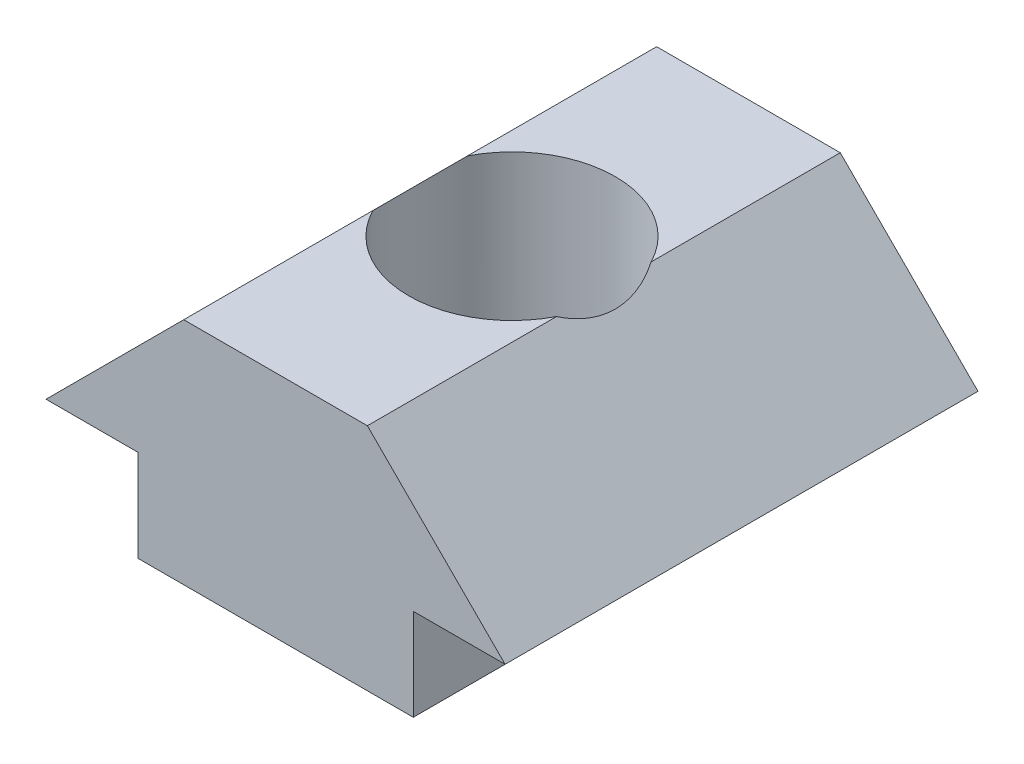
ISO-10303-21;
HEADER;
FILE_DESCRIPTION(('STEP AP214'),'2;1');
FILE_NAME('part.step','',(''),(''),'','','');
FILE_SCHEMA(('AUTOMOTIVE_DESIGN { 1 0 10303 214 1 1 1 1 }'));
ENDSEC;
DATA;
#1=APPLICATION_CONTEXT('core data for automotive mechanical design processes');
#2=APPLICATION_PROTOCOL_DEFINITION('international standard','automotive_design',2000,#1);
#3=PRODUCT_CONTEXT('',#1,'mechanical');
#4=PRODUCT('Part','Part','',(#3));
#5=PRODUCT_RELATED_PRODUCT_CATEGORY('part','',(#4));
#6=PRODUCT_DEFINITION_FORMATION('','',#4);
#7=PRODUCT_DEFINITION_CONTEXT('part definition',#1,'design');
#8=PRODUCT_DEFINITION('design','',#6,#7);
#9=PRODUCT_DEFINITION_SHAPE('','',#8);
#10=(LENGTH_UNIT() NAMED_UNIT(*) SI_UNIT(.MILLI.,.METRE.));
#11=(NAMED_UNIT(*) PLANE_ANGLE_UNIT() SI_UNIT($,.RADIAN.));
#12=(NAMED_UNIT(*) SI_UNIT($,.STERADIAN.) SOLID_ANGLE_UNIT());
#13=UNCERTAINTY_MEASURE_WITH_UNIT(LENGTH_MEASURE(1.E-05),#10,'distance_accuracy_value','');
#14=(GEOMETRIC_REPRESENTATION_CONTEXT(3) GLOBAL_UNCERTAINTY_ASSIGNED_CONTEXT((#13)) GLOBAL_UNIT_ASSIGNED_CONTEXT((#10,
#11,#12)) REPRESENTATION_CONTEXT('',''));
#15=CARTESIAN_POINT('',(0.,0.,0.));
#16=DIRECTION('',(0.,0.,1.));
#17=DIRECTION('',(1.,0.,0.));
#18=AXIS2_PLACEMENT_3D('',#15,#16,#17);
#19=CARTESIAN_POINT('',(-1.,5.,10.3));
#20=DIRECTION('',(0.,-1.,0.));
#21=DIRECTION('',(0.,0.,-1.));
#22=AXIS2_PLACEMENT_3D('',#19,#20,#21);
#23=PLANE('',#22);
#24=CARTESIAN_POINT('',(-3.,5.,5.15));
#25=DIRECTION('',(0.,1.,0.));
#26=DIRECTION('',(0.,0.,1.));
#27=AXIS2_PLACEMENT_3D('',#24,#25,#26);
#28=CIRCLE('',#27,2.24999999999999);
#29=CARTESIAN_POINT('',(-1.,5.,4.11922359359561));
#30=VERTEX_POINT('',#29);
#31=CARTESIAN_POINT('',(-5.,5.,4.11922359359561));
#32=VERTEX_POINT('',#31);
#33=EDGE_CURVE('E45',#30,#32,#28,.T.);
#34=ORIENTED_EDGE('',*,*,#33,.F.);
#35=DIRECTION('',(0.,0.,-1.));
#36=VECTOR('',#35,1.);
#37=CARTESIAN_POINT('',(-1.,5.,10.3));
#38=LINE('',#37,#36);
#39=CARTESIAN_POINT('',(-1.,5.,0.));
#40=VERTEX_POINT('',#39);
#41=EDGE_CURVE('E167',#30,#40,#38,.T.);
#42=ORIENTED_EDGE('',*,*,#41,.T.);
#43=DIRECTION('',(-1.,0.,0.));
#44=VECTOR('',#43,1.);
#45=CARTESIAN_POINT('',(-1.,5.,0.));
#46=LINE('',#45,#44);
#47=CARTESIAN_POINT('',(-5.,5.,0.));
#48=VERTEX_POINT('',#47);
#49=EDGE_CURVE('E155',#40,#48,#46,.T.);
#50=ORIENTED_EDGE('',*,*,#49,.T.);
#51=DIRECTION('',(0.,0.,-1.));
#52=VECTOR('',#51,1.);
#53=CARTESIAN_POINT('',(-5.,5.,10.3));
#54=LINE('',#53,#52);
#55=EDGE_CURVE('E135',#32,#48,#54,.T.);
#56=ORIENTED_EDGE('',*,*,#55,.F.);
#57=EDGE_LOOP('',(#34,#42,#50,#56));
#58=FACE_BOUND('',#57,.T.);
#59=ADVANCED_FACE('F37',(#58),#23,.F.);
#60=CARTESIAN_POINT('',(-5.,5.,6.18077640640439));
#61=VERTEX_POINT('',#60);
#62=CARTESIAN_POINT('',(-1.,5.,6.18077640640439));
#63=VERTEX_POINT('',#62);
#64=EDGE_CURVE('E177',#61,#63,#28,.T.);
#65=ORIENTED_EDGE('',*,*,#64,.F.);
#66=CARTESIAN_POINT('',(-5.,5.,10.3));
#67=VERTEX_POINT('',#66);
#68=EDGE_CURVE('E165',#67,#61,#54,.T.);
#69=ORIENTED_EDGE('',*,*,#68,.F.);
#70=DIRECTION('',(-1.,0.,0.));
#71=VECTOR('',#70,1.);
#72=CARTESIAN_POINT('',(-1.,5.,10.3));
#73=LINE('',#72,#71);
#74=CARTESIAN_POINT('',(-1.,5.,10.3));
#75=VERTEX_POINT('',#74);
#76=EDGE_CURVE('E123',#75,#67,#73,.T.);
#77=ORIENTED_EDGE('',*,*,#76,.F.);
#78=EDGE_CURVE('E168',#75,#63,#38,.T.);
#79=ORIENTED_EDGE('',*,*,#78,.T.);
#80=EDGE_LOOP('',(#65,#69,#77,#79));
#81=FACE_BOUND('',#80,.T.);
#82=ADVANCED_FACE('F201',(#81),#23,.F.);
#83=CARTESIAN_POINT('',(-6.,0.,10.3));
#84=DIRECTION('',(0.,1.,0.));
#85=DIRECTION('',(0.,0.,1.));
#86=AXIS2_PLACEMENT_3D('',#83,#84,#85);
#87=PLANE('',#86);
#88=CARTESIAN_POINT('',(-3.,0.,5.15));
#89=DIRECTION('',(0.,1.,0.));
#90=DIRECTION('',(0.,0.,1.));
#91=AXIS2_PLACEMENT_3D('',#88,#89,#90);
#92=CIRCLE('',#91,2.25);
#93=CARTESIAN_POINT('',(-3.,0.,7.4));
#94=VERTEX_POINT('',#93);
#95=EDGE_CURVE('E184',#94,#94,#92,.T.);
#96=ORIENTED_EDGE('',*,*,#95,.T.);
#97=EDGE_LOOP('',(#96));
#98=FACE_BOUND('',#97,.T.);
#99=DIRECTION('',(1.,0.,0.));
#100=VECTOR('',#99,1.);
#101=CARTESIAN_POINT('',(-6.,0.,0.));
#102=LINE('',#101,#100);
#103=CARTESIAN_POINT('',(-6.,0.,0.));
#104=VERTEX_POINT('',#103);
#105=CARTESIAN_POINT('',(0.,0.,0.));
#106=VERTEX_POINT('',#105);
#107=EDGE_CURVE('E144',#104,#106,#102,.T.);
#108=ORIENTED_EDGE('',*,*,#107,.T.);
#109=DIRECTION('',(0.,0.,-1.));
#110=VECTOR('',#109,1.);
#111=CARTESIAN_POINT('',(0.,0.,10.3));
#112=LINE('',#111,#110);
#113=CARTESIAN_POINT('',(0.,0.,10.3));
#114=VERTEX_POINT('',#113);
#115=EDGE_CURVE('E176',#114,#106,#112,.T.);
#116=ORIENTED_EDGE('',*,*,#115,.F.);
#117=DIRECTION('',(1.,0.,0.));
#118=VECTOR('',#117,1.);
#119=CARTESIAN_POINT('',(-6.,0.,10.3));
#120=LINE('',#119,#118);
#121=CARTESIAN_POINT('',(-6.,0.,10.3));
#122=VERTEX_POINT('',#121);
#123=EDGE_CURVE('E162',#122,#114,#120,.T.);
#124=ORIENTED_EDGE('',*,*,#123,.F.);
#125=DIRECTION('',(0.,0.,-1.));
#126=VECTOR('',#125,1.);
#127=CARTESIAN_POINT('',(-6.,0.,10.3));
#128=LINE('',#127,#126);
#129=EDGE_CURVE('E140',#122,#104,#128,.T.);
#130=ORIENTED_EDGE('',*,*,#129,.T.);
#131=EDGE_LOOP('',(#108,#116,#124,#130));
#132=FACE_BOUND('',#131,.T.);
#133=ADVANCED_FACE('F39',(#98,#132),#87,.F.);
#134=CARTESIAN_POINT('',(0.,0.,10.3));
#135=DIRECTION('',(-1.,0.,0.));
#136=DIRECTION('',(0.,0.,1.));
#137=AXIS2_PLACEMENT_3D('',#134,#135,#136);
#138=PLANE('',#137);
#139=DIRECTION('',(0.,1.,0.));
#140=VECTOR('',#139,1.);
#141=CARTESIAN_POINT('',(0.,0.,0.));
#142=LINE('',#141,#140);
#143=CARTESIAN_POINT('',(0.,2.00000000000003,0.));
#144=VERTEX_POINT('',#143);
#145=EDGE_CURVE('E147',#106,#144,#142,.T.);
#146=ORIENTED_EDGE('',*,*,#145,.T.);
#147=DIRECTION('',(0.,0.,-1.));
#148=VECTOR('',#147,1.);
#149=CARTESIAN_POINT('',(0.,2.00000000000003,10.3));
#150=LINE('',#149,#148);
#151=CARTESIAN_POINT('',(0.,2.00000000000003,10.3));
#152=VERTEX_POINT('',#151);
#153=EDGE_CURVE('E174',#152,#144,#150,.T.);
#154=ORIENTED_EDGE('',*,*,#153,.F.);
#155=DIRECTION('',(0.,1.,0.));
#156=VECTOR('',#155,1.);
#157=CARTESIAN_POINT('',(0.,0.,10.3));
#158=LINE('',#157,#156);
#159=EDGE_CURVE('E101',#114,#152,#158,.T.);
#160=ORIENTED_EDGE('',*,*,#159,.F.);
#161=ORIENTED_EDGE('',*,*,#115,.T.);
#162=EDGE_LOOP('',(#146,#154,#160,#161));
#163=FACE_BOUND('',#162,.T.);
#164=ADVANCED_FACE('F214',(#163),#138,.F.);
#165=CARTESIAN_POINT('',(0.,2.00000000000003,10.3));
#166=DIRECTION('',(0.,1.,0.));
#167=DIRECTION('',(0.,0.,1.));
#168=AXIS2_PLACEMENT_3D('',#165,#166,#167);
#169=PLANE('',#168);
#170=DIRECTION('',(1.,0.,0.));
#171=VECTOR('',#170,1.);
#172=CARTESIAN_POINT('',(0.,2.00000000000003,0.));
#173=LINE('',#172,#171);
#174=CARTESIAN_POINT('',(2.,2.00000000000003,0.));
#175=VERTEX_POINT('',#174);
#176=EDGE_CURVE('E150',#144,#175,#173,.T.);
#177=ORIENTED_EDGE('',*,*,#176,.T.);
#178=DIRECTION('',(0.,0.,-1.));
#179=VECTOR('',#178,1.);
#180=CARTESIAN_POINT('',(2.,2.00000000000003,10.3));
#181=LINE('',#180,#179);
#182=CARTESIAN_POINT('',(2.,2.00000000000003,10.3));
#183=VERTEX_POINT('',#182);
#184=EDGE_CURVE('E171',#183,#175,#181,.T.);
#185=ORIENTED_EDGE('',*,*,#184,.F.);
#186=DIRECTION('',(1.,0.,0.));
#187=VECTOR('',#186,1.);
#188=CARTESIAN_POINT('',(0.,2.00000000000003,10.3));
#189=LINE('',#188,#187);
#190=EDGE_CURVE('E190',#152,#183,#189,.T.);
#191=ORIENTED_EDGE('',*,*,#190,.F.);
#192=ORIENTED_EDGE('',*,*,#153,.T.);
#193=EDGE_LOOP('',(#177,#185,#191,#192));
#194=FACE_BOUND('',#193,.T.);
#195=ADVANCED_FACE('F217',(#194),#169,.F.);
#196=CARTESIAN_POINT('',(2.,2.00000000000003,10.3));
#197=DIRECTION('',(-0.707106781186544,-0.707106781186551,0.));
#198=DIRECTION('',(0.707106781186551,-0.707106781186544,0.));
#199=AXIS2_PLACEMENT_3D('',#196,#197,#198);
#200=PLANE('',#199);
#201=ORIENTED_EDGE('',*,*,#41,.F.);
#202=CARTESIAN_POINT('',(-3.,6.99999999999998,5.15));
#203=DIRECTION('',(-0.707106781186544,-0.707106781186551,0.));
#204=DIRECTION('',(-0.707106781186551,0.707106781186544,0.));
#205=AXIS2_PLACEMENT_3D('',#202,#203,#204);
#206=ELLIPSE('',#205,3.18198051533944,2.24999999999999);
#207=EDGE_CURVE('E148',#30,#63,#206,.T.);
#208=ORIENTED_EDGE('',*,*,#207,.T.);
#209=ORIENTED_EDGE('',*,*,#78,.F.);
#210=DIRECTION('',(-0.707106781186551,0.707106781186544,0.));
#211=VECTOR('',#210,1.);
#212=CARTESIAN_POINT('',(2.,2.00000000000003,10.3));
#213=LINE('',#212,#211);
#214=EDGE_CURVE('E192',#183,#75,#213,.T.);
#215=ORIENTED_EDGE('',*,*,#214,.F.);
#216=ORIENTED_EDGE('',*,*,#184,.T.);
#217=DIRECTION('',(-0.707106781186551,0.707106781186544,0.));
#218=VECTOR('',#217,1.);
#219=CARTESIAN_POINT('',(2.,2.00000000000003,0.));
#220=LINE('',#219,#218);
#221=EDGE_CURVE('E152',#175,#40,#220,.T.);
#222=ORIENTED_EDGE('',*,*,#221,.T.);
#223=EDGE_LOOP('',(#201,#208,#209,#215,#216,#222));
#224=FACE_BOUND('',#223,.T.);
#225=ADVANCED_FACE('F199',(#224),#200,.F.);
#226=CARTESIAN_POINT('',(-5.,5.,10.3));
#227=DIRECTION('',(0.707106781186544,-0.707106781186551,0.));
#228=DIRECTION('',(0.707106781186551,0.707106781186544,0.));
#229=AXIS2_PLACEMENT_3D('',#226,#227,#228);
#230=PLANE('',#229);
#231=ORIENTED_EDGE('',*,*,#68,.T.);
#232=CARTESIAN_POINT('',(-3.,6.99999999999998,5.15));
#233=DIRECTION('',(0.707106781186544,-0.707106781186551,0.));
#234=DIRECTION('',(0.707106781186551,0.707106781186544,0.));
#235=AXIS2_PLACEMENT_3D('',#232,#233,#234);
#236=ELLIPSE('',#235,3.18198051533944,2.24999999999999);
#237=EDGE_CURVE('E11',#61,#32,#236,.T.);
#238=ORIENTED_EDGE('',*,*,#237,.T.);
#239=ORIENTED_EDGE('',*,*,#55,.T.);
#240=DIRECTION('',(-0.707106781186551,-0.707106781186544,0.));
#241=VECTOR('',#240,1.);
#242=CARTESIAN_POINT('',(-5.,5.,0.));
#243=LINE('',#242,#241);
#244=CARTESIAN_POINT('',(-8.,2.00000000000003,0.));
#245=VERTEX_POINT('',#244);
#246=EDGE_CURVE('E132',#48,#245,#243,.T.);
#247=ORIENTED_EDGE('',*,*,#246,.T.);
#248=DIRECTION('',(0.,0.,-1.));
#249=VECTOR('',#248,1.);
#250=CARTESIAN_POINT('',(-8.,2.00000000000003,10.3));
#251=LINE('',#250,#249);
#252=CARTESIAN_POINT('',(-8.,2.00000000000003,10.3));
#253=VERTEX_POINT('',#252);
#254=EDGE_CURVE('E129',#253,#245,#251,.T.);
#255=ORIENTED_EDGE('',*,*,#254,.F.);
#256=DIRECTION('',(-0.707106781186551,-0.707106781186544,0.));
#257=VECTOR('',#256,1.);
#258=CARTESIAN_POINT('',(-5.,5.,10.3));
#259=LINE('',#258,#257);
#260=EDGE_CURVE('E116',#67,#253,#259,.T.);
#261=ORIENTED_EDGE('',*,*,#260,.F.);
#262=EDGE_LOOP('',(#231,#238,#239,#247,#255,#261));
#263=FACE_BOUND('',#262,.T.);
#264=ADVANCED_FACE('F130',(#263),#230,.F.);
#265=CARTESIAN_POINT('',(-8.,2.00000000000003,10.3));
#266=DIRECTION('',(0.,1.,0.));
#267=DIRECTION('',(0.,0.,1.));
#268=AXIS2_PLACEMENT_3D('',#265,#266,#267);
#269=PLANE('',#268);
#270=DIRECTION('',(1.,0.,0.));
#271=VECTOR('',#270,1.);
#272=CARTESIAN_POINT('',(-8.,2.00000000000003,0.));
#273=LINE('',#272,#271);
#274=CARTESIAN_POINT('',(-6.,2.00000000000003,0.));
#275=VERTEX_POINT('',#274);
#276=EDGE_CURVE('E159',#245,#275,#273,.T.);
#277=ORIENTED_EDGE('',*,*,#276,.T.);
#278=DIRECTION('',(0.,0.,-1.));
#279=VECTOR('',#278,1.);
#280=CARTESIAN_POINT('',(-6.,2.00000000000003,10.3));
#281=LINE('',#280,#279);
#282=CARTESIAN_POINT('',(-6.,2.00000000000003,10.3));
#283=VERTEX_POINT('',#282);
#284=EDGE_CURVE('E136',#283,#275,#281,.T.);
#285=ORIENTED_EDGE('',*,*,#284,.F.);
#286=DIRECTION('',(1.,0.,0.));
#287=VECTOR('',#286,1.);
#288=CARTESIAN_POINT('',(-8.,2.00000000000003,10.3));
#289=LINE('',#288,#287);
#290=EDGE_CURVE('E120',#253,#283,#289,.T.);
#291=ORIENTED_EDGE('',*,*,#290,.F.);
#292=ORIENTED_EDGE('',*,*,#254,.T.);
#293=EDGE_LOOP('',(#277,#285,#291,#292));
#294=FACE_BOUND('',#293,.T.);
#295=ADVANCED_FACE('F138',(#294),#269,.F.);
#296=CARTESIAN_POINT('',(-6.,2.00000000000003,10.3));
#297=DIRECTION('',(1.,0.,0.));
#298=DIRECTION('',(0.,0.,-1.));
#299=AXIS2_PLACEMENT_3D('',#296,#297,#298);
#300=PLANE('',#299);
#301=DIRECTION('',(0.,-1.,0.));
#302=VECTOR('',#301,1.);
#303=CARTESIAN_POINT('',(-6.,2.00000000000003,0.));
#304=LINE('',#303,#302);
#305=EDGE_CURVE('E92',#275,#104,#304,.T.);
#306=ORIENTED_EDGE('',*,*,#305,.T.);
#307=ORIENTED_EDGE('',*,*,#129,.F.);
#308=DIRECTION('',(0.,-1.,0.));
#309=VECTOR('',#308,1.);
#310=CARTESIAN_POINT('',(-6.,2.00000000000003,10.3));
#311=LINE('',#310,#309);
#312=EDGE_CURVE('E59',#283,#122,#311,.T.);
#313=ORIENTED_EDGE('',*,*,#312,.F.);
#314=ORIENTED_EDGE('',*,*,#284,.T.);
#315=EDGE_LOOP('',(#306,#307,#313,#314));
#316=FACE_BOUND('',#315,.T.);
#317=ADVANCED_FACE('F211',(#316),#300,.F.);
#318=CARTESIAN_POINT('',(0.,0.,10.3));
#319=DIRECTION('',(0.,0.,1.));
#320=DIRECTION('',(1.,0.,0.));
#321=AXIS2_PLACEMENT_3D('',#318,#319,#320);
#322=PLANE('',#321);
#323=ORIENTED_EDGE('',*,*,#123,.T.);
#324=ORIENTED_EDGE('',*,*,#159,.T.);
#325=ORIENTED_EDGE('',*,*,#190,.T.);
#326=ORIENTED_EDGE('',*,*,#214,.T.);
#327=ORIENTED_EDGE('',*,*,#76,.T.);
#328=ORIENTED_EDGE('',*,*,#260,.T.);
#329=ORIENTED_EDGE('',*,*,#290,.T.);
#330=ORIENTED_EDGE('',*,*,#312,.T.);
#331=EDGE_LOOP('',(#323,#324,#325,#326,#327,#328,#329,#330));
#332=FACE_BOUND('',#331,.T.);
#333=ADVANCED_FACE('F118',(#332),#322,.T.);
#334=CARTESIAN_POINT('',(0.,0.,0.));
#335=DIRECTION('',(0.,0.,1.));
#336=DIRECTION('',(1.,0.,0.));
#337=AXIS2_PLACEMENT_3D('',#334,#335,#336);
#338=PLANE('',#337);
#339=ORIENTED_EDGE('',*,*,#107,.F.);
#340=ORIENTED_EDGE('',*,*,#305,.F.);
#341=ORIENTED_EDGE('',*,*,#276,.F.);
#342=ORIENTED_EDGE('',*,*,#246,.F.);
#343=ORIENTED_EDGE('',*,*,#49,.F.);
#344=ORIENTED_EDGE('',*,*,#221,.F.);
#345=ORIENTED_EDGE('',*,*,#176,.F.);
#346=ORIENTED_EDGE('',*,*,#145,.F.);
#347=EDGE_LOOP('',(#339,#340,#341,#342,#343,#344,#345,#346));
#348=FACE_BOUND('',#347,.T.);
#349=ADVANCED_FACE('F210',(#348),#338,.F.);
#350=CARTESIAN_POINT('',(-3.,5.,5.15));
#351=DIRECTION('',(0.,1.,0.));
#352=DIRECTION('',(0.,0.,1.));
#353=AXIS2_PLACEMENT_3D('',#350,#351,#352);
#354=CYLINDRICAL_SURFACE('',#353,2.24999999999999);
#355=ORIENTED_EDGE('',*,*,#95,.F.);
#356=EDGE_LOOP('',(#355));
#357=FACE_BOUND('',#356,.T.);
#358=ORIENTED_EDGE('',*,*,#33,.T.);
#359=ORIENTED_EDGE('',*,*,#237,.F.);
#360=ORIENTED_EDGE('',*,*,#64,.T.);
#361=ORIENTED_EDGE('',*,*,#207,.F.);
#362=EDGE_LOOP('',(#358,#359,#360,#361));
#363=FACE_BOUND('',#362,.T.);
#364=ADVANCED_FACE('F219',(#357,#363),#354,.F.);
#365=CLOSED_SHELL('',(#59,#82,#133,#164,#195,#225,#264,#295,#317,#333,#349,#364));
#366=MANIFOLD_SOLID_BREP('B2',#365);
#367=ADVANCED_BREP_SHAPE_REPRESENTATION('',(#18,#366),#14);
#368=SHAPE_DEFINITION_REPRESENTATION(#9,#367);
ENDSEC;
END-ISO-10303-21;
